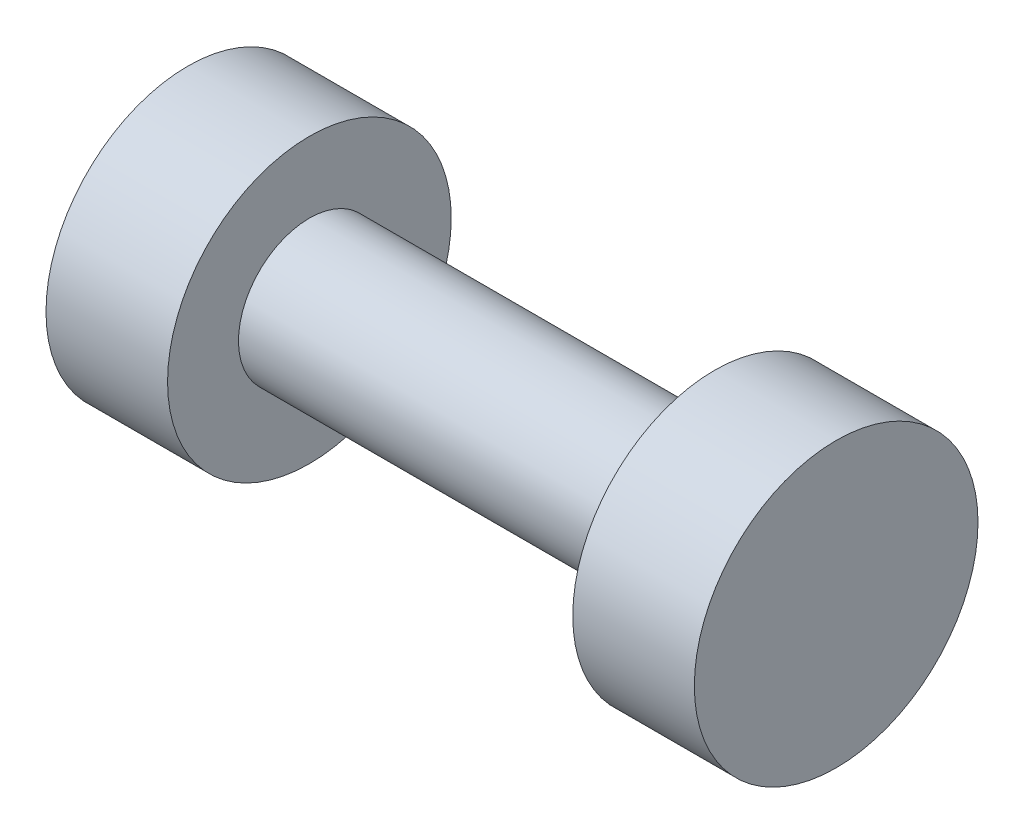
ISO-10303-21;
HEADER;
FILE_DESCRIPTION(('STEP AP214'),'2;1');
FILE_NAME('part.step','',(''),(''),'','','');
FILE_SCHEMA(('AUTOMOTIVE_DESIGN { 1 0 10303 214 1 1 1 1 }'));
ENDSEC;
DATA;
#1=APPLICATION_CONTEXT('core data for automotive mechanical design processes');
#2=APPLICATION_PROTOCOL_DEFINITION('international standard','automotive_design',2000,#1);
#3=PRODUCT_CONTEXT('',#1,'mechanical');
#4=PRODUCT('Part','Part','',(#3));
#5=PRODUCT_RELATED_PRODUCT_CATEGORY('part','',(#4));
#6=PRODUCT_DEFINITION_FORMATION('','',#4);
#7=PRODUCT_DEFINITION_CONTEXT('part definition',#1,'design');
#8=PRODUCT_DEFINITION('design','',#6,#7);
#9=PRODUCT_DEFINITION_SHAPE('','',#8);
#10=(LENGTH_UNIT() NAMED_UNIT(*) SI_UNIT(.MILLI.,.METRE.));
#11=(NAMED_UNIT(*) PLANE_ANGLE_UNIT() SI_UNIT($,.RADIAN.));
#12=(NAMED_UNIT(*) SI_UNIT($,.STERADIAN.) SOLID_ANGLE_UNIT());
#13=UNCERTAINTY_MEASURE_WITH_UNIT(LENGTH_MEASURE(1.E-05),#10,'distance_accuracy_value','');
#14=(GEOMETRIC_REPRESENTATION_CONTEXT(3) GLOBAL_UNCERTAINTY_ASSIGNED_CONTEXT((#13)) GLOBAL_UNIT_ASSIGNED_CONTEXT((#10,
#11,#12)) REPRESENTATION_CONTEXT('',''));
#15=CARTESIAN_POINT('',(0.,0.,0.));
#16=DIRECTION('',(0.,0.,1.));
#17=DIRECTION('',(1.,0.,0.));
#18=AXIS2_PLACEMENT_3D('',#15,#16,#17);
#19=CARTESIAN_POINT('',(-80.,0.,0.));
#20=DIRECTION('',(-1.,0.,0.));
#21=DIRECTION('',(0.,-1.,0.));
#22=AXIS2_PLACEMENT_3D('',#19,#20,#21);
#23=PLANE('',#22);
#24=CARTESIAN_POINT('',(-80.,0.,0.));
#25=DIRECTION('',(1.,0.,0.));
#26=DIRECTION('',(0.,1.,0.));
#27=AXIS2_PLACEMENT_3D('',#24,#25,#26);
#28=CIRCLE('',#27,35.);
#29=CARTESIAN_POINT('',(-80.,35.,0.));
#30=VERTEX_POINT('',#29);
#31=EDGE_CURVE('E10',#30,#30,#28,.T.);
#32=ORIENTED_EDGE('',*,*,#31,.F.);
#33=EDGE_LOOP('',(#32));
#34=FACE_BOUND('',#33,.T.);
#35=ADVANCED_FACE('F31',(#34),#23,.T.);
#36=CARTESIAN_POINT('',(80.,0.,0.));
#37=DIRECTION('',(1.,0.,0.));
#38=DIRECTION('',(0.,1.,0.));
#39=AXIS2_PLACEMENT_3D('',#36,#37,#38);
#40=CYLINDRICAL_SURFACE('',#39,35.);
#41=ORIENTED_EDGE('',*,*,#31,.T.);
#42=EDGE_LOOP('',(#41));
#43=FACE_BOUND('',#42,.T.);
#44=CARTESIAN_POINT('',(-50.,0.,0.));
#45=DIRECTION('',(1.,0.,0.));
#46=DIRECTION('',(0.,1.,0.));
#47=AXIS2_PLACEMENT_3D('',#44,#45,#46);
#48=CIRCLE('',#47,35.);
#49=CARTESIAN_POINT('',(-50.,35.,0.));
#50=VERTEX_POINT('',#49);
#51=EDGE_CURVE('E37',#50,#50,#48,.T.);
#52=ORIENTED_EDGE('',*,*,#51,.F.);
#53=EDGE_LOOP('',(#52));
#54=FACE_BOUND('',#53,.T.);
#55=ADVANCED_FACE('F73',(#43,#54),#40,.T.);
#56=CARTESIAN_POINT('',(-50.,35.,0.));
#57=DIRECTION('',(1.,0.,0.));
#58=DIRECTION('',(0.,1.,0.));
#59=AXIS2_PLACEMENT_3D('',#56,#57,#58);
#60=PLANE('',#59);
#61=ORIENTED_EDGE('',*,*,#51,.T.);
#62=EDGE_LOOP('',(#61));
#63=FACE_BOUND('',#62,.T.);
#64=CARTESIAN_POINT('',(-50.,0.,0.));
#65=DIRECTION('',(1.,0.,0.));
#66=DIRECTION('',(0.,1.,0.));
#67=AXIS2_PLACEMENT_3D('',#64,#65,#66);
#68=CIRCLE('',#67,17.5);
#69=CARTESIAN_POINT('',(-50.,17.5,0.));
#70=VERTEX_POINT('',#69);
#71=EDGE_CURVE('E41',#70,#70,#68,.T.);
#72=ORIENTED_EDGE('',*,*,#71,.F.);
#73=EDGE_LOOP('',(#72));
#74=FACE_BOUND('',#73,.T.);
#75=ADVANCED_FACE('F78',(#63,#74),#60,.T.);
#76=CARTESIAN_POINT('',(80.,0.,0.));
#77=DIRECTION('',(1.,0.,0.));
#78=DIRECTION('',(0.,1.,0.));
#79=AXIS2_PLACEMENT_3D('',#76,#77,#78);
#80=CYLINDRICAL_SURFACE('',#79,17.5);
#81=ORIENTED_EDGE('',*,*,#71,.T.);
#82=EDGE_LOOP('',(#81));
#83=FACE_BOUND('',#82,.T.);
#84=CARTESIAN_POINT('',(50.,0.,0.));
#85=DIRECTION('',(1.,0.,0.));
#86=DIRECTION('',(0.,1.,0.));
#87=AXIS2_PLACEMENT_3D('',#84,#85,#86);
#88=CIRCLE('',#87,17.5);
#89=CARTESIAN_POINT('',(50.,17.5,0.));
#90=VERTEX_POINT('',#89);
#91=EDGE_CURVE('E45',#90,#90,#88,.T.);
#92=ORIENTED_EDGE('',*,*,#91,.F.);
#93=EDGE_LOOP('',(#92));
#94=FACE_BOUND('',#93,.T.);
#95=ADVANCED_FACE('F69',(#83,#94),#80,.T.);
#96=CARTESIAN_POINT('',(50.,17.5,0.));
#97=DIRECTION('',(-1.,0.,0.));
#98=DIRECTION('',(0.,-1.,0.));
#99=AXIS2_PLACEMENT_3D('',#96,#97,#98);
#100=PLANE('',#99);
#101=ORIENTED_EDGE('',*,*,#91,.T.);
#102=EDGE_LOOP('',(#101));
#103=FACE_BOUND('',#102,.T.);
#104=CARTESIAN_POINT('',(50.,0.,0.));
#105=DIRECTION('',(1.,0.,0.));
#106=DIRECTION('',(0.,1.,0.));
#107=AXIS2_PLACEMENT_3D('',#104,#105,#106);
#108=CIRCLE('',#107,35.);
#109=CARTESIAN_POINT('',(50.,35.,0.));
#110=VERTEX_POINT('',#109);
#111=EDGE_CURVE('E50',#110,#110,#108,.T.);
#112=ORIENTED_EDGE('',*,*,#111,.F.);
#113=EDGE_LOOP('',(#112));
#114=FACE_BOUND('',#113,.T.);
#115=ADVANCED_FACE('F61',(#103,#114),#100,.T.);
#116=CARTESIAN_POINT('',(80.,0.,0.));
#117=DIRECTION('',(1.,0.,0.));
#118=DIRECTION('',(0.,1.,0.));
#119=AXIS2_PLACEMENT_3D('',#116,#117,#118);
#120=CYLINDRICAL_SURFACE('',#119,35.);
#121=ORIENTED_EDGE('',*,*,#111,.T.);
#122=EDGE_LOOP('',(#121));
#123=FACE_BOUND('',#122,.T.);
#124=CARTESIAN_POINT('',(80.,0.,0.));
#125=DIRECTION('',(1.,0.,0.));
#126=DIRECTION('',(0.,1.,0.));
#127=AXIS2_PLACEMENT_3D('',#124,#125,#126);
#128=CIRCLE('',#127,35.);
#129=CARTESIAN_POINT('',(80.,35.,0.));
#130=VERTEX_POINT('',#129);
#131=EDGE_CURVE('E53',#130,#130,#128,.T.);
#132=ORIENTED_EDGE('',*,*,#131,.F.);
#133=EDGE_LOOP('',(#132));
#134=FACE_BOUND('',#133,.T.);
#135=ADVANCED_FACE('F59',(#123,#134),#120,.T.);
#136=CARTESIAN_POINT('',(80.,35.,0.));
#137=DIRECTION('',(1.,0.,0.));
#138=DIRECTION('',(0.,1.,0.));
#139=AXIS2_PLACEMENT_3D('',#136,#137,#138);
#140=PLANE('',#139);
#141=ORIENTED_EDGE('',*,*,#131,.T.);
#142=EDGE_LOOP('',(#141));
#143=FACE_BOUND('',#142,.T.);
#144=ADVANCED_FACE('F57',(#143),#140,.T.);
#145=CLOSED_SHELL('',(#35,#55,#75,#95,#115,#135,#144));
#146=MANIFOLD_SOLID_BREP('B2',#145);
#147=ADVANCED_BREP_SHAPE_REPRESENTATION('',(#18,#146),#14);
#148=SHAPE_DEFINITION_REPRESENTATION(#9,#147);
ENDSEC;
END-ISO-10303-21;
